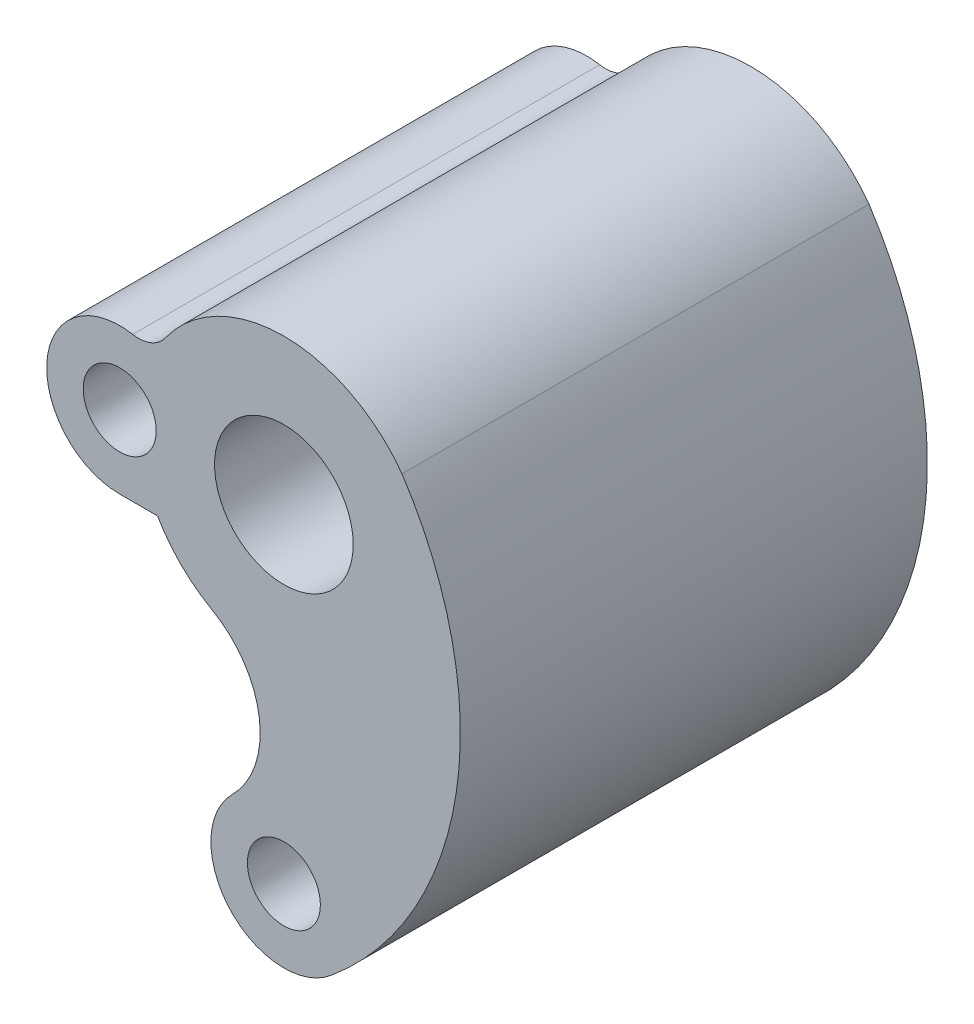
ISO-10303-21;
HEADER;
FILE_DESCRIPTION(('STEP AP214'),'2;1');
FILE_NAME('part.step','',(''),(''),'','','');
FILE_SCHEMA(('AUTOMOTIVE_DESIGN { 1 0 10303 214 1 1 1 1 }'));
ENDSEC;
DATA;
#1=APPLICATION_CONTEXT('core data for automotive mechanical design processes');
#2=APPLICATION_PROTOCOL_DEFINITION('international standard','automotive_design',2000,#1);
#3=PRODUCT_CONTEXT('',#1,'mechanical');
#4=PRODUCT('Part','Part','',(#3));
#5=PRODUCT_RELATED_PRODUCT_CATEGORY('part','',(#4));
#6=PRODUCT_DEFINITION_FORMATION('','',#4);
#7=PRODUCT_DEFINITION_CONTEXT('part definition',#1,'design');
#8=PRODUCT_DEFINITION('design','',#6,#7);
#9=PRODUCT_DEFINITION_SHAPE('','',#8);
#10=(LENGTH_UNIT() NAMED_UNIT(*) SI_UNIT(.MILLI.,.METRE.));
#11=(NAMED_UNIT(*) PLANE_ANGLE_UNIT() SI_UNIT($,.RADIAN.));
#12=(NAMED_UNIT(*) SI_UNIT($,.STERADIAN.) SOLID_ANGLE_UNIT());
#13=UNCERTAINTY_MEASURE_WITH_UNIT(LENGTH_MEASURE(1.E-05),#10,'distance_accuracy_value','');
#14=(GEOMETRIC_REPRESENTATION_CONTEXT(3) GLOBAL_UNCERTAINTY_ASSIGNED_CONTEXT((#13)) GLOBAL_UNIT_ASSIGNED_CONTEXT((#10,
#11,#12)) REPRESENTATION_CONTEXT('',''));
#15=CARTESIAN_POINT('',(0.,0.,0.));
#16=DIRECTION('',(0.,0.,1.));
#17=DIRECTION('',(1.,0.,0.));
#18=AXIS2_PLACEMENT_3D('',#15,#16,#17);
#19=CARTESIAN_POINT('',(-11.8330801093545,0.,128.));
#20=DIRECTION('',(0.,0.,-1.));
#21=DIRECTION('',(-1.,0.,0.));
#22=AXIS2_PLACEMENT_3D('',#19,#20,#21);
#23=CYLINDRICAL_SURFACE('',#22,40.);
#24=CARTESIAN_POINT('',(-11.8330801093545,0.,0.));
#25=DIRECTION('',(0.,0.,1.));
#26=DIRECTION('',(1.,0.,0.));
#27=AXIS2_PLACEMENT_3D('',#24,#25,#26);
#28=CIRCLE('',#27,40.);
#29=CARTESIAN_POINT('',(20.5421284143465,23.4913999805648,0.));
#30=VERTEX_POINT('',#29);
#31=CARTESIAN_POINT('',(-44.3500869120755,23.2947261969698,0.));
#32=VERTEX_POINT('',#31);
#33=EDGE_CURVE('E142',#30,#32,#28,.T.);
#34=ORIENTED_EDGE('',*,*,#33,.T.);
#35=DIRECTION('',(0.,0.,-1.));
#36=VECTOR('',#35,1.);
#37=CARTESIAN_POINT('',(-44.3500869120755,23.2947261969698,128.));
#38=LINE('',#37,#36);
#39=CARTESIAN_POINT('',(-44.3500869120755,23.2947261969698,128.));
#40=VERTEX_POINT('',#39);
#41=EDGE_CURVE('E11',#40,#32,#38,.T.);
#42=ORIENTED_EDGE('',*,*,#41,.F.);
#43=CARTESIAN_POINT('',(-11.8330801093545,0.,128.));
#44=DIRECTION('',(0.,0.,1.));
#45=DIRECTION('',(1.,0.,0.));
#46=AXIS2_PLACEMENT_3D('',#43,#44,#45);
#47=CIRCLE('',#46,40.);
#48=CARTESIAN_POINT('',(20.5421284143465,23.4913999805648,128.));
#49=VERTEX_POINT('',#48);
#50=EDGE_CURVE('E187',#49,#40,#47,.T.);
#51=ORIENTED_EDGE('',*,*,#50,.F.);
#52=DIRECTION('',(0.,0.,-1.));
#53=VECTOR('',#52,1.);
#54=CARTESIAN_POINT('',(20.5421284143465,23.4913999805648,128.));
#55=LINE('',#54,#53);
#56=EDGE_CURVE('E132',#49,#30,#55,.T.);
#57=ORIENTED_EDGE('',*,*,#56,.T.);
#58=EDGE_LOOP('',(#34,#42,#51,#57));
#59=FACE_BOUND('',#58,.T.);
#60=ADVANCED_FACE('F35',(#59),#23,.T.);
#61=CARTESIAN_POINT('',(-51.6664134426878,28.536039591288,128.));
#62=DIRECTION('',(0.,0.,-1.));
#63=DIRECTION('',(-1.,0.,0.));
#64=AXIS2_PLACEMENT_3D('',#61,#62,#63);
#65=CYLINDRICAL_SURFACE('',#64,9.);
#66=CARTESIAN_POINT('',(-51.6664134426878,28.536039591288,0.));
#67=DIRECTION('',(0.,0.,1.));
#68=DIRECTION('',(1.,0.,0.));
#69=AXIS2_PLACEMENT_3D('',#66,#67,#68);
#70=CIRCLE('',#69,9.);
#71=CARTESIAN_POINT('',(-53.2698617185499,19.6800273043365,0.));
#72=VERTEX_POINT('',#71);
#73=EDGE_CURVE('E145',#32,#72,#70,.F.);
#74=ORIENTED_EDGE('',*,*,#73,.T.);
#75=DIRECTION('',(0.,0.,-1.));
#76=VECTOR('',#75,1.);
#77=CARTESIAN_POINT('',(-53.2698617185499,19.6800273043365,128.));
#78=LINE('',#77,#76);
#79=CARTESIAN_POINT('',(-53.2698617185499,19.6800273043365,128.));
#80=VERTEX_POINT('',#79);
#81=EDGE_CURVE('E44',#80,#72,#78,.T.);
#82=ORIENTED_EDGE('',*,*,#81,.F.);
#83=CARTESIAN_POINT('',(-51.6664134426878,28.536039591288,128.));
#84=DIRECTION('',(0.,0.,1.));
#85=DIRECTION('',(1.,0.,0.));
#86=AXIS2_PLACEMENT_3D('',#83,#84,#85);
#87=CIRCLE('',#86,9.);
#88=EDGE_CURVE('E94',#40,#80,#87,.F.);
#89=ORIENTED_EDGE('',*,*,#88,.F.);
#90=ORIENTED_EDGE('',*,*,#41,.T.);
#91=EDGE_LOOP('',(#74,#82,#89,#90));
#92=FACE_BOUND('',#91,.T.);
#93=ADVANCED_FACE('F202',(#92),#65,.F.);
#94=CARTESIAN_POINT('',(-56.8330801093545,0.,128.));
#95=DIRECTION('',(0.,0.,-1.));
#96=DIRECTION('',(-1.,0.,0.));
#97=AXIS2_PLACEMENT_3D('',#94,#95,#96);
#98=CYLINDRICAL_SURFACE('',#97,20.);
#99=CARTESIAN_POINT('',(-56.8330801093545,0.,0.));
#100=DIRECTION('',(0.,0.,1.));
#101=DIRECTION('',(1.,0.,0.));
#102=AXIS2_PLACEMENT_3D('',#99,#100,#101);
#103=CIRCLE('',#102,20.);
#104=CARTESIAN_POINT('',(-56.8330801093545,-20.,0.));
#105=VERTEX_POINT('',#104);
#106=EDGE_CURVE('E147',#72,#105,#103,.T.);
#107=ORIENTED_EDGE('',*,*,#106,.T.);
#108=DIRECTION('',(0.,0.,-1.));
#109=VECTOR('',#108,1.);
#110=CARTESIAN_POINT('',(-56.8330801093545,-20.,128.));
#111=LINE('',#110,#109);
#112=CARTESIAN_POINT('',(-56.8330801093545,-20.,128.));
#113=VERTEX_POINT('',#112);
#114=EDGE_CURVE('E164',#113,#105,#111,.T.);
#115=ORIENTED_EDGE('',*,*,#114,.F.);
#116=CARTESIAN_POINT('',(-56.8330801093545,0.,128.));
#117=DIRECTION('',(0.,0.,1.));
#118=DIRECTION('',(1.,0.,0.));
#119=AXIS2_PLACEMENT_3D('',#116,#117,#118);
#120=CIRCLE('',#119,20.);
#121=EDGE_CURVE('E172',#80,#113,#120,.T.);
#122=ORIENTED_EDGE('',*,*,#121,.F.);
#123=ORIENTED_EDGE('',*,*,#81,.T.);
#124=EDGE_LOOP('',(#107,#115,#122,#123));
#125=FACE_BOUND('',#124,.T.);
#126=ADVANCED_FACE('F170',(#125),#98,.T.);
#127=CARTESIAN_POINT('',(0.,-20.,128.));
#128=DIRECTION('',(0.,1.,0.));
#129=DIRECTION('',(0.,0.,1.));
#130=AXIS2_PLACEMENT_3D('',#127,#128,#129);
#131=PLANE('',#130);
#132=DIRECTION('',(1.,0.,0.));
#133=VECTOR('',#132,1.);
#134=CARTESIAN_POINT('',(0.,-20.,0.));
#135=LINE('',#134,#133);
#136=CARTESIAN_POINT('',(-46.474096260732,-20.,0.));
#137=VERTEX_POINT('',#136);
#138=EDGE_CURVE('E149',#105,#137,#135,.T.);
#139=ORIENTED_EDGE('',*,*,#138,.T.);
#140=DIRECTION('',(0.,0.,-1.));
#141=VECTOR('',#140,1.);
#142=CARTESIAN_POINT('',(-46.474096260732,-20.,128.));
#143=LINE('',#142,#141);
#144=CARTESIAN_POINT('',(-46.474096260732,-20.,128.));
#145=VERTEX_POINT('',#144);
#146=EDGE_CURVE('E161',#145,#137,#143,.T.);
#147=ORIENTED_EDGE('',*,*,#146,.F.);
#148=DIRECTION('',(1.,0.,0.));
#149=VECTOR('',#148,1.);
#150=CARTESIAN_POINT('',(0.,-20.,128.));
#151=LINE('',#150,#149);
#152=EDGE_CURVE('E127',#113,#145,#151,.T.);
#153=ORIENTED_EDGE('',*,*,#152,.F.);
#154=ORIENTED_EDGE('',*,*,#114,.T.);
#155=EDGE_LOOP('',(#139,#147,#153,#154));
#156=FACE_BOUND('',#155,.T.);
#157=ADVANCED_FACE('F180',(#156),#131,.F.);
#158=CARTESIAN_POINT('',(-11.8330801093545,0.,128.));
#159=DIRECTION('',(0.,0.,-1.));
#160=DIRECTION('',(-1.,0.,0.));
#161=AXIS2_PLACEMENT_3D('',#158,#159,#160);
#162=CYLINDRICAL_SURFACE('',#161,40.);
#163=CARTESIAN_POINT('',(-11.8330801093545,0.,0.));
#164=DIRECTION('',(0.,0.,1.));
#165=DIRECTION('',(1.,0.,0.));
#166=AXIS2_PLACEMENT_3D('',#163,#164,#165);
#167=CIRCLE('',#166,40.);
#168=CARTESIAN_POINT('',(-31.5289849987002,-34.8148148148148,0.));
#169=VERTEX_POINT('',#168);
#170=EDGE_CURVE('E151',#137,#169,#167,.T.);
#171=ORIENTED_EDGE('',*,*,#170,.T.);
#172=DIRECTION('',(0.,0.,-1.));
#173=VECTOR('',#172,1.);
#174=CARTESIAN_POINT('',(-31.5289849987002,-34.8148148148148,128.));
#175=LINE('',#174,#173);
#176=CARTESIAN_POINT('',(-31.5289849987002,-34.8148148148148,128.));
#177=VERTEX_POINT('',#176);
#178=EDGE_CURVE('E116',#177,#169,#175,.T.);
#179=ORIENTED_EDGE('',*,*,#178,.F.);
#180=CARTESIAN_POINT('',(-11.8330801093545,0.,128.));
#181=DIRECTION('',(0.,0.,1.));
#182=DIRECTION('',(1.,0.,0.));
#183=AXIS2_PLACEMENT_3D('',#180,#181,#182);
#184=CIRCLE('',#183,40.);
#185=EDGE_CURVE('E124',#145,#177,#184,.T.);
#186=ORIENTED_EDGE('',*,*,#185,.F.);
#187=ORIENTED_EDGE('',*,*,#146,.T.);
#188=EDGE_LOOP('',(#171,#179,#186,#187));
#189=FACE_BOUND('',#188,.T.);
#190=ADVANCED_FACE('F183',(#189),#162,.T.);
#191=CARTESIAN_POINT('',(-44.3313231767748,-57.4444444444444,128.));
#192=DIRECTION('',(0.,0.,-1.));
#193=DIRECTION('',(-1.,0.,0.));
#194=AXIS2_PLACEMENT_3D('',#191,#192,#193);
#195=CYLINDRICAL_SURFACE('',#194,26.);
#196=CARTESIAN_POINT('',(-44.3313231767748,-57.4444444444444,0.));
#197=DIRECTION('',(0.,0.,1.));
#198=DIRECTION('',(1.,0.,0.));
#199=AXIS2_PLACEMENT_3D('',#196,#197,#198);
#200=CIRCLE('',#199,26.);
#201=CARTESIAN_POINT('',(-25.9627510082329,-75.8454106280193,0.));
#202=VERTEX_POINT('',#201);
#203=EDGE_CURVE('E115',#202,#169,#200,.T.);
#204=ORIENTED_EDGE('',*,*,#203,.F.);
#205=DIRECTION('',(0.,0.,-1.));
#206=VECTOR('',#205,1.);
#207=CARTESIAN_POINT('',(-25.9627510082329,-75.8454106280193,128.));
#208=LINE('',#207,#206);
#209=CARTESIAN_POINT('',(-25.9627510082329,-75.8454106280193,128.));
#210=VERTEX_POINT('',#209);
#211=EDGE_CURVE('E109',#210,#202,#208,.T.);
#212=ORIENTED_EDGE('',*,*,#211,.F.);
#213=CARTESIAN_POINT('',(-44.3313231767748,-57.4444444444444,128.));
#214=DIRECTION('',(0.,0.,1.));
#215=DIRECTION('',(1.,0.,0.));
#216=AXIS2_PLACEMENT_3D('',#213,#214,#215);
#217=CIRCLE('',#216,26.);
#218=EDGE_CURVE('E113',#210,#177,#217,.T.);
#219=ORIENTED_EDGE('',*,*,#218,.T.);
#220=ORIENTED_EDGE('',*,*,#178,.T.);
#221=EDGE_LOOP('',(#204,#212,#219,#220));
#222=FACE_BOUND('',#221,.T.);
#223=ADVANCED_FACE('F111',(#222),#195,.F.);
#224=CARTESIAN_POINT('',(-11.8330801093544,-90.,128.));
#225=DIRECTION('',(0.,0.,-1.));
#226=DIRECTION('',(-1.,0.,0.));
#227=AXIS2_PLACEMENT_3D('',#224,#225,#226);
#228=CYLINDRICAL_SURFACE('',#227,20.);
#229=CARTESIAN_POINT('',(-11.8330801093544,-90.,0.));
#230=DIRECTION('',(0.,0.,1.));
#231=DIRECTION('',(1.,0.,0.));
#232=AXIS2_PLACEMENT_3D('',#229,#230,#231);
#233=CIRCLE('',#232,20.);
#234=CARTESIAN_POINT('',(1.31563320406289,-105.070213608359,0.));
#235=VERTEX_POINT('',#234);
#236=EDGE_CURVE('E80',#202,#235,#233,.T.);
#237=ORIENTED_EDGE('',*,*,#236,.T.);
#238=DIRECTION('',(0.,0.,-1.));
#239=VECTOR('',#238,1.);
#240=CARTESIAN_POINT('',(1.31563320406289,-105.070213608359,128.));
#241=LINE('',#240,#239);
#242=CARTESIAN_POINT('',(1.31563320406289,-105.070213608359,128.));
#243=VERTEX_POINT('',#242);
#244=EDGE_CURVE('E117',#243,#235,#241,.T.);
#245=ORIENTED_EDGE('',*,*,#244,.F.);
#246=CARTESIAN_POINT('',(-11.8330801093544,-90.,128.));
#247=DIRECTION('',(0.,0.,1.));
#248=DIRECTION('',(1.,0.,0.));
#249=AXIS2_PLACEMENT_3D('',#246,#247,#248);
#250=CIRCLE('',#249,20.);
#251=EDGE_CURVE('E119',#210,#243,#250,.T.);
#252=ORIENTED_EDGE('',*,*,#251,.F.);
#253=ORIENTED_EDGE('',*,*,#211,.T.);
#254=EDGE_LOOP('',(#237,#245,#252,#253));
#255=FACE_BOUND('',#254,.T.);
#256=ADVANCED_FACE('F120',(#255),#228,.T.);
#257=CARTESIAN_POINT('',(-11.8330801093545,0.,128.));
#258=DIRECTION('',(0.,0.,-1.));
#259=DIRECTION('',(-1.,0.,0.));
#260=AXIS2_PLACEMENT_3D('',#257,#258,#259);
#261=CYLINDRICAL_SURFACE('',#260,19.);
#262=CARTESIAN_POINT('',(-11.8330801093545,0.,128.));
#263=DIRECTION('',(0.,0.,1.));
#264=DIRECTION('',(1.,0.,0.));
#265=AXIS2_PLACEMENT_3D('',#262,#263,#264);
#266=CIRCLE('',#265,19.);
#267=CARTESIAN_POINT('',(7.16691989064554,0.,128.));
#268=VERTEX_POINT('',#267);
#269=EDGE_CURVE('E311',#268,#268,#266,.T.);
#270=ORIENTED_EDGE('',*,*,#269,.T.);
#271=EDGE_LOOP('',(#270));
#272=FACE_BOUND('',#271,.T.);
#273=CARTESIAN_POINT('',(-11.8330801093545,0.,0.));
#274=DIRECTION('',(0.,0.,1.));
#275=DIRECTION('',(1.,0.,0.));
#276=AXIS2_PLACEMENT_3D('',#273,#274,#275);
#277=CIRCLE('',#276,19.);
#278=CARTESIAN_POINT('',(7.16691989064554,0.,0.));
#279=VERTEX_POINT('',#278);
#280=EDGE_CURVE('E139',#279,#279,#277,.T.);
#281=ORIENTED_EDGE('',*,*,#280,.F.);
#282=EDGE_LOOP('',(#281));
#283=FACE_BOUND('',#282,.T.);
#284=ADVANCED_FACE('F210',(#272,#283),#261,.F.);
#285=CARTESIAN_POINT('',(-11.8330801093544,-90.,128.));
#286=DIRECTION('',(0.,0.,-1.));
#287=DIRECTION('',(-1.,0.,0.));
#288=AXIS2_PLACEMENT_3D('',#285,#286,#287);
#289=CYLINDRICAL_SURFACE('',#288,10.);
#290=CARTESIAN_POINT('',(-11.8330801093544,-90.,128.));
#291=DIRECTION('',(0.,0.,1.));
#292=DIRECTION('',(1.,0.,0.));
#293=AXIS2_PLACEMENT_3D('',#290,#291,#292);
#294=CIRCLE('',#293,10.);
#295=CARTESIAN_POINT('',(-1.83308010935444,-90.,128.));
#296=VERTEX_POINT('',#295);
#297=EDGE_CURVE('E220',#296,#296,#294,.T.);
#298=ORIENTED_EDGE('',*,*,#297,.T.);
#299=EDGE_LOOP('',(#298));
#300=FACE_BOUND('',#299,.T.);
#301=CARTESIAN_POINT('',(-11.8330801093544,-90.,0.));
#302=DIRECTION('',(0.,0.,1.));
#303=DIRECTION('',(1.,0.,0.));
#304=AXIS2_PLACEMENT_3D('',#301,#302,#303);
#305=CIRCLE('',#304,10.);
#306=CARTESIAN_POINT('',(-1.83308010935444,-90.,0.));
#307=VERTEX_POINT('',#306);
#308=EDGE_CURVE('E136',#307,#307,#305,.T.);
#309=ORIENTED_EDGE('',*,*,#308,.F.);
#310=EDGE_LOOP('',(#309));
#311=FACE_BOUND('',#310,.T.);
#312=ADVANCED_FACE('F197',(#300,#311),#289,.F.);
#313=CARTESIAN_POINT('',(-56.8330801093545,0.,128.));
#314=DIRECTION('',(0.,0.,-1.));
#315=DIRECTION('',(-1.,0.,0.));
#316=AXIS2_PLACEMENT_3D('',#313,#314,#315);
#317=CYLINDRICAL_SURFACE('',#316,10.);
#318=CARTESIAN_POINT('',(-56.8330801093545,0.,128.));
#319=DIRECTION('',(0.,0.,1.));
#320=DIRECTION('',(1.,0.,0.));
#321=AXIS2_PLACEMENT_3D('',#318,#319,#320);
#322=CIRCLE('',#321,10.);
#323=CARTESIAN_POINT('',(-46.8330801093545,0.,128.));
#324=VERTEX_POINT('',#323);
#325=EDGE_CURVE('E157',#324,#324,#322,.T.);
#326=ORIENTED_EDGE('',*,*,#325,.T.);
#327=EDGE_LOOP('',(#326));
#328=FACE_BOUND('',#327,.T.);
#329=CARTESIAN_POINT('',(-56.8330801093545,0.,0.));
#330=DIRECTION('',(0.,0.,1.));
#331=DIRECTION('',(1.,0.,0.));
#332=AXIS2_PLACEMENT_3D('',#329,#330,#331);
#333=CIRCLE('',#332,10.);
#334=CARTESIAN_POINT('',(-46.8330801093545,0.,0.));
#335=VERTEX_POINT('',#334);
#336=EDGE_CURVE('E133',#335,#335,#333,.T.);
#337=ORIENTED_EDGE('',*,*,#336,.F.);
#338=EDGE_LOOP('',(#337));
#339=FACE_BOUND('',#338,.T.);
#340=ADVANCED_FACE('F37',(#328,#339),#317,.F.);
#341=CARTESIAN_POINT('',(-61.0416545362203,-30.026153969818,128.));
#342=DIRECTION('',(0.,0.,-1.));
#343=DIRECTION('',(-1.,0.,0.));
#344=AXIS2_PLACEMENT_3D('',#341,#342,#343);
#345=CYLINDRICAL_SURFACE('',#344,97.5707037043258);
#346=CARTESIAN_POINT('',(-61.0416545362203,-30.026153969818,0.));
#347=DIRECTION('',(0.,0.,1.));
#348=DIRECTION('',(1.,0.,0.));
#349=AXIS2_PLACEMENT_3D('',#346,#347,#348);
#350=CIRCLE('',#349,97.5707037043258);
#351=EDGE_CURVE('E86',#235,#30,#350,.T.);
#352=ORIENTED_EDGE('',*,*,#351,.T.);
#353=ORIENTED_EDGE('',*,*,#56,.F.);
#354=CARTESIAN_POINT('',(-61.0416545362203,-30.026153969818,128.));
#355=DIRECTION('',(0.,0.,1.));
#356=DIRECTION('',(1.,0.,0.));
#357=AXIS2_PLACEMENT_3D('',#354,#355,#356);
#358=CIRCLE('',#357,97.5707037043258);
#359=EDGE_CURVE('E52',#243,#49,#358,.T.);
#360=ORIENTED_EDGE('',*,*,#359,.F.);
#361=ORIENTED_EDGE('',*,*,#244,.T.);
#362=EDGE_LOOP('',(#352,#353,#360,#361));
#363=FACE_BOUND('',#362,.T.);
#364=ADVANCED_FACE('F188',(#363),#345,.T.);
#365=CARTESIAN_POINT('',(0.,0.,128.));
#366=DIRECTION('',(0.,0.,1.));
#367=DIRECTION('',(1.,0.,0.));
#368=AXIS2_PLACEMENT_3D('',#365,#366,#367);
#369=PLANE('',#368);
#370=ORIENTED_EDGE('',*,*,#325,.F.);
#371=EDGE_LOOP('',(#370));
#372=FACE_BOUND('',#371,.T.);
#373=ORIENTED_EDGE('',*,*,#297,.F.);
#374=EDGE_LOOP('',(#373));
#375=FACE_BOUND('',#374,.T.);
#376=ORIENTED_EDGE('',*,*,#269,.F.);
#377=EDGE_LOOP('',(#376));
#378=FACE_BOUND('',#377,.T.);
#379=ORIENTED_EDGE('',*,*,#50,.T.);
#380=ORIENTED_EDGE('',*,*,#88,.T.);
#381=ORIENTED_EDGE('',*,*,#121,.T.);
#382=ORIENTED_EDGE('',*,*,#152,.T.);
#383=ORIENTED_EDGE('',*,*,#185,.T.);
#384=ORIENTED_EDGE('',*,*,#218,.F.);
#385=ORIENTED_EDGE('',*,*,#251,.T.);
#386=ORIENTED_EDGE('',*,*,#359,.T.);
#387=EDGE_LOOP('',(#379,#380,#381,#382,#383,#384,#385,#386));
#388=FACE_BOUND('',#387,.T.);
#389=ADVANCED_FACE('F122',(#372,#375,#378,#388),#369,.T.);
#390=CARTESIAN_POINT('',(0.,0.,0.));
#391=DIRECTION('',(0.,0.,1.));
#392=DIRECTION('',(1.,0.,0.));
#393=AXIS2_PLACEMENT_3D('',#390,#391,#392);
#394=PLANE('',#393);
#395=ORIENTED_EDGE('',*,*,#336,.T.);
#396=EDGE_LOOP('',(#395));
#397=FACE_BOUND('',#396,.T.);
#398=ORIENTED_EDGE('',*,*,#308,.T.);
#399=EDGE_LOOP('',(#398));
#400=FACE_BOUND('',#399,.T.);
#401=ORIENTED_EDGE('',*,*,#280,.T.);
#402=EDGE_LOOP('',(#401));
#403=FACE_BOUND('',#402,.T.);
#404=ORIENTED_EDGE('',*,*,#33,.F.);
#405=ORIENTED_EDGE('',*,*,#351,.F.);
#406=ORIENTED_EDGE('',*,*,#236,.F.);
#407=ORIENTED_EDGE('',*,*,#203,.T.);
#408=ORIENTED_EDGE('',*,*,#170,.F.);
#409=ORIENTED_EDGE('',*,*,#138,.F.);
#410=ORIENTED_EDGE('',*,*,#106,.F.);
#411=ORIENTED_EDGE('',*,*,#73,.F.);
#412=EDGE_LOOP('',(#404,#405,#406,#407,#408,#409,#410,#411));
#413=FACE_BOUND('',#412,.T.);
#414=ADVANCED_FACE('F176',(#397,#400,#403,#413),#394,.F.);
#415=CLOSED_SHELL('',(#60,#93,#126,#157,#190,#223,#256,#284,#312,#340,#364,#389,#414));
#416=MANIFOLD_SOLID_BREP('B2',#415);
#417=ADVANCED_BREP_SHAPE_REPRESENTATION('',(#18,#416),#14);
#418=SHAPE_DEFINITION_REPRESENTATION(#9,#417);
ENDSEC;
END-ISO-10303-21;
